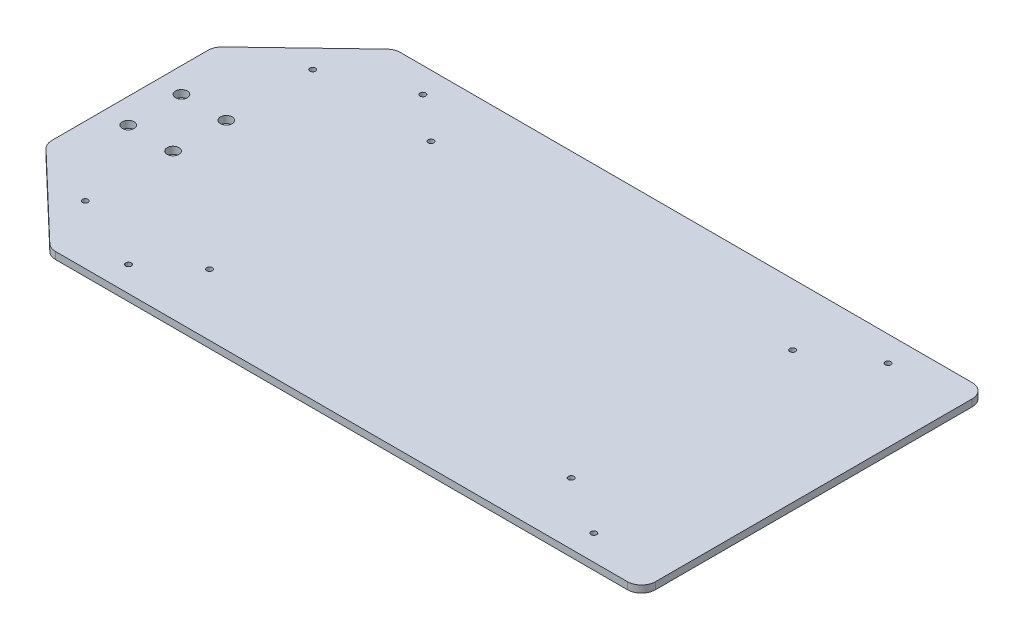
ISO-10303-21;
HEADER;
FILE_DESCRIPTION(('STEP AP214'),'2;1');
FILE_NAME('part.step','',(''),(''),'','','');
FILE_SCHEMA(('AUTOMOTIVE_DESIGN { 1 0 10303 214 1 1 1 1 }'));
ENDSEC;
DATA;
#1=APPLICATION_CONTEXT('core data for automotive mechanical design processes');
#2=APPLICATION_PROTOCOL_DEFINITION('international standard','automotive_design',2000,#1);
#3=PRODUCT_CONTEXT('',#1,'mechanical');
#4=PRODUCT('Part','Part','',(#3));
#5=PRODUCT_RELATED_PRODUCT_CATEGORY('part','',(#4));
#6=PRODUCT_DEFINITION_FORMATION('','',#4);
#7=PRODUCT_DEFINITION_CONTEXT('part definition',#1,'design');
#8=PRODUCT_DEFINITION('design','',#6,#7);
#9=PRODUCT_DEFINITION_SHAPE('','',#8);
#10=(LENGTH_UNIT() NAMED_UNIT(*) SI_UNIT(.MILLI.,.METRE.));
#11=(NAMED_UNIT(*) PLANE_ANGLE_UNIT() SI_UNIT($,.RADIAN.));
#12=(NAMED_UNIT(*) SI_UNIT($,.STERADIAN.) SOLID_ANGLE_UNIT());
#13=UNCERTAINTY_MEASURE_WITH_UNIT(LENGTH_MEASURE(1.E-05),#10,'distance_accuracy_value','');
#14=(GEOMETRIC_REPRESENTATION_CONTEXT(3) GLOBAL_UNCERTAINTY_ASSIGNED_CONTEXT((#13)) GLOBAL_UNIT_ASSIGNED_CONTEXT((#10,
#11,#12)) REPRESENTATION_CONTEXT('',''));
#15=CARTESIAN_POINT('',(0.,0.,0.));
#16=DIRECTION('',(0.,0.,1.));
#17=DIRECTION('',(1.,0.,0.));
#18=AXIS2_PLACEMENT_3D('',#15,#16,#17);
#19=CARTESIAN_POINT('',(-110.,2.5,0.));
#20=DIRECTION('',(1.,0.,0.));
#21=DIRECTION('',(0.,0.,-1.));
#22=AXIS2_PLACEMENT_3D('',#19,#20,#21);
#23=PLANE('',#22);
#24=DIRECTION('',(0.,0.,1.));
#25=VECTOR('',#24,1.);
#26=CARTESIAN_POINT('',(-110.,2.5,0.));
#27=LINE('',#26,#25);
#28=CARTESIAN_POINT('',(-110.,2.5,-27.8604971246611));
#29=VERTEX_POINT('',#28);
#30=CARTESIAN_POINT('',(-110.,2.5,27.8604971246611));
#31=VERTEX_POINT('',#30);
#32=EDGE_CURVE('E146',#29,#31,#27,.T.);
#33=ORIENTED_EDGE('',*,*,#32,.F.);
#34=DIRECTION('',(0.,-1.,0.));
#35=VECTOR('',#34,1.);
#36=CARTESIAN_POINT('',(-110.,0.,-27.8604971246611));
#37=LINE('',#36,#35);
#38=CARTESIAN_POINT('',(-110.,0.,-27.8604971246611));
#39=VERTEX_POINT('',#38);
#40=EDGE_CURVE('E182',#29,#39,#37,.T.);
#41=ORIENTED_EDGE('',*,*,#40,.T.);
#42=DIRECTION('',(0.,0.,1.));
#43=VECTOR('',#42,1.);
#44=CARTESIAN_POINT('',(-110.,0.,0.));
#45=LINE('',#44,#43);
#46=CARTESIAN_POINT('',(-110.,0.,27.8604971246611));
#47=VERTEX_POINT('',#46);
#48=EDGE_CURVE('E130',#39,#47,#45,.T.);
#49=ORIENTED_EDGE('',*,*,#48,.T.);
#50=DIRECTION('',(0.,-1.,0.));
#51=VECTOR('',#50,1.);
#52=CARTESIAN_POINT('',(-110.,2.5,27.8604971246611));
#53=LINE('',#52,#51);
#54=EDGE_CURVE('E180',#47,#31,#53,.F.);
#55=ORIENTED_EDGE('',*,*,#54,.T.);
#56=EDGE_LOOP('',(#33,#41,#49,#55));
#57=FACE_BOUND('',#56,.T.);
#58=ADVANCED_FACE('F34',(#57),#23,.F.);
#59=CARTESIAN_POINT('',(-67.4270270270271,2.5,70.6378378378378));
#60=DIRECTION('',(0.690475746682501,0.,-0.723355544143572));
#61=DIRECTION('',(-0.723355544143572,0.,-0.690475746682501));
#62=AXIS2_PLACEMENT_3D('',#59,#60,#61);
#63=PLANE('',#62);
#64=DIRECTION('',(0.723355544143572,0.,0.690475746682501));
#65=VECTOR('',#64,1.);
#66=CARTESIAN_POINT('',(-67.4270270270271,2.5,70.6378378378378));
#67=LINE('',#66,#65);
#68=CARTESIAN_POINT('',(-108.452378733413,2.5,31.477274845379));
#69=VERTEX_POINT('',#68);
#70=CARTESIAN_POINT('',(-78.449090006867,2.5,60.1167777207179));
#71=VERTEX_POINT('',#70);
#72=EDGE_CURVE('E290',#69,#71,#67,.T.);
#73=ORIENTED_EDGE('',*,*,#72,.F.);
#74=DIRECTION('',(0.,-1.,0.));
#75=VECTOR('',#74,1.);
#76=CARTESIAN_POINT('',(-108.452378733413,2.5,31.477274845379));
#77=LINE('',#76,#75);
#78=CARTESIAN_POINT('',(-108.452378733413,0.,31.477274845379));
#79=VERTEX_POINT('',#78);
#80=EDGE_CURVE('E186',#69,#79,#77,.T.);
#81=ORIENTED_EDGE('',*,*,#80,.T.);
#82=DIRECTION('',(0.723355544143572,0.,0.690475746682501));
#83=VECTOR('',#82,1.);
#84=CARTESIAN_POINT('',(-67.4270270270271,0.,70.6378378378378));
#85=LINE('',#84,#83);
#86=CARTESIAN_POINT('',(-78.449090006867,0.,60.1167777207179));
#87=VERTEX_POINT('',#86);
#88=EDGE_CURVE('E298',#79,#87,#85,.T.);
#89=ORIENTED_EDGE('',*,*,#88,.T.);
#90=DIRECTION('',(0.,-1.,0.));
#91=VECTOR('',#90,1.);
#92=CARTESIAN_POINT('',(-78.449090006867,2.5,60.1167777207179));
#93=LINE('',#92,#91);
#94=EDGE_CURVE('E184',#87,#71,#93,.F.);
#95=ORIENTED_EDGE('',*,*,#94,.T.);
#96=EDGE_LOOP('',(#73,#81,#89,#95));
#97=FACE_BOUND('',#96,.T.);
#98=ADVANCED_FACE('F322',(#97),#63,.F.);
#99=CARTESIAN_POINT('',(0.,2.5,61.5));
#100=DIRECTION('',(0.,0.,-1.));
#101=DIRECTION('',(-1.,0.,0.));
#102=AXIS2_PLACEMENT_3D('',#99,#100,#101);
#103=PLANE('',#102);
#104=DIRECTION('',(1.,0.,0.));
#105=VECTOR('',#104,1.);
#106=CARTESIAN_POINT('',(0.,2.5,61.5));
#107=LINE('',#106,#105);
#108=CARTESIAN_POINT('',(-74.9967112734545,2.5,61.5));
#109=VERTEX_POINT('',#108);
#110=CARTESIAN_POINT('',(129.,2.5,61.5));
#111=VERTEX_POINT('',#110);
#112=EDGE_CURVE('E293',#109,#111,#107,.T.);
#113=ORIENTED_EDGE('',*,*,#112,.F.);
#114=DIRECTION('',(0.,-1.,0.));
#115=VECTOR('',#114,1.);
#116=CARTESIAN_POINT('',(-74.9967112734545,2.5,61.5));
#117=LINE('',#116,#115);
#118=CARTESIAN_POINT('',(-74.9967112734545,0.,61.5));
#119=VERTEX_POINT('',#118);
#120=EDGE_CURVE('E191',#109,#119,#117,.T.);
#121=ORIENTED_EDGE('',*,*,#120,.T.);
#122=DIRECTION('',(1.,0.,0.));
#123=VECTOR('',#122,1.);
#124=CARTESIAN_POINT('',(0.,0.,61.5));
#125=LINE('',#124,#123);
#126=CARTESIAN_POINT('',(129.,0.,61.5));
#127=VERTEX_POINT('',#126);
#128=EDGE_CURVE('E301',#119,#127,#125,.T.);
#129=ORIENTED_EDGE('',*,*,#128,.T.);
#130=DIRECTION('',(0.,-1.,0.));
#131=VECTOR('',#130,1.);
#132=CARTESIAN_POINT('',(129.,2.5,61.5));
#133=LINE('',#132,#131);
#134=EDGE_CURVE('E189',#127,#111,#133,.F.);
#135=ORIENTED_EDGE('',*,*,#134,.T.);
#136=EDGE_LOOP('',(#113,#121,#129,#135));
#137=FACE_BOUND('',#136,.T.);
#138=ADVANCED_FACE('F330',(#137),#103,.F.);
#139=CARTESIAN_POINT('',(0.,2.5,-61.5));
#140=DIRECTION('',(0.,0.,-1.));
#141=DIRECTION('',(-1.,0.,0.));
#142=AXIS2_PLACEMENT_3D('',#139,#140,#141);
#143=PLANE('',#142);
#144=DIRECTION('',(1.,0.,0.));
#145=VECTOR('',#144,1.);
#146=CARTESIAN_POINT('',(0.,0.,-61.5));
#147=LINE('',#146,#145);
#148=CARTESIAN_POINT('',(-74.9967112734545,0.,-61.5));
#149=VERTEX_POINT('',#148);
#150=CARTESIAN_POINT('',(129.,0.,-61.5));
#151=VERTEX_POINT('',#150);
#152=EDGE_CURVE('E147',#149,#151,#147,.T.);
#153=ORIENTED_EDGE('',*,*,#152,.F.);
#154=DIRECTION('',(0.,-1.,0.));
#155=VECTOR('',#154,1.);
#156=CARTESIAN_POINT('',(-74.9967112734545,2.5,-61.5));
#157=LINE('',#156,#155);
#158=CARTESIAN_POINT('',(-74.9967112734545,2.5,-61.5));
#159=VERTEX_POINT('',#158);
#160=EDGE_CURVE('E169',#149,#159,#157,.F.);
#161=ORIENTED_EDGE('',*,*,#160,.T.);
#162=DIRECTION('',(1.,0.,0.));
#163=VECTOR('',#162,1.);
#164=CARTESIAN_POINT('',(0.,2.5,-61.5));
#165=LINE('',#164,#163);
#166=CARTESIAN_POINT('',(129.,2.5,-61.5));
#167=VERTEX_POINT('',#166);
#168=EDGE_CURVE('E156',#159,#167,#165,.T.);
#169=ORIENTED_EDGE('',*,*,#168,.T.);
#170=DIRECTION('',(0.,1.,0.));
#171=VECTOR('',#170,1.);
#172=CARTESIAN_POINT('',(129.,2.5,-61.5));
#173=LINE('',#172,#171);
#174=EDGE_CURVE('E167',#167,#151,#173,.F.);
#175=ORIENTED_EDGE('',*,*,#174,.T.);
#176=EDGE_LOOP('',(#153,#161,#169,#175));
#177=FACE_BOUND('',#176,.T.);
#178=ADVANCED_FACE('F309',(#177),#143,.T.);
#179=CARTESIAN_POINT('',(-67.427027027027,2.5,-70.6378378378378));
#180=DIRECTION('',(-0.6904757466825,0.,-0.723355544143572));
#181=DIRECTION('',(-0.723355544143572,0.,0.690475746682501));
#182=AXIS2_PLACEMENT_3D('',#179,#180,#181);
#183=PLANE('',#182);
#184=DIRECTION('',(0.723355544143572,0.,-0.690475746682501));
#185=VECTOR('',#184,1.);
#186=CARTESIAN_POINT('',(-67.427027027027,2.5,-70.6378378378378));
#187=LINE('',#186,#185);
#188=CARTESIAN_POINT('',(-108.452378733413,2.5,-31.477274845379));
#189=VERTEX_POINT('',#188);
#190=CARTESIAN_POINT('',(-78.449090006867,2.5,-60.1167777207178));
#191=VERTEX_POINT('',#190);
#192=EDGE_CURVE('E152',#189,#191,#187,.T.);
#193=ORIENTED_EDGE('',*,*,#192,.T.);
#194=DIRECTION('',(0.,-1.,0.));
#195=VECTOR('',#194,1.);
#196=CARTESIAN_POINT('',(-78.449090006867,2.5,-60.1167777207178));
#197=LINE('',#196,#195);
#198=CARTESIAN_POINT('',(-78.449090006867,0.,-60.1167777207178));
#199=VERTEX_POINT('',#198);
#200=EDGE_CURVE('E145',#191,#199,#197,.T.);
#201=ORIENTED_EDGE('',*,*,#200,.T.);
#202=DIRECTION('',(0.723355544143572,0.,-0.690475746682501));
#203=VECTOR('',#202,1.);
#204=CARTESIAN_POINT('',(-67.427027027027,0.,-70.6378378378378));
#205=LINE('',#204,#203);
#206=CARTESIAN_POINT('',(-108.452378733413,0.,-31.477274845379));
#207=VERTEX_POINT('',#206);
#208=EDGE_CURVE('E128',#207,#199,#205,.T.);
#209=ORIENTED_EDGE('',*,*,#208,.F.);
#210=DIRECTION('',(0.,-1.,0.));
#211=VECTOR('',#210,1.);
#212=CARTESIAN_POINT('',(-108.452378733413,2.5,-31.477274845379));
#213=LINE('',#212,#211);
#214=EDGE_CURVE('E142',#207,#189,#213,.F.);
#215=ORIENTED_EDGE('',*,*,#214,.T.);
#216=EDGE_LOOP('',(#193,#201,#209,#215));
#217=FACE_BOUND('',#216,.T.);
#218=ADVANCED_FACE('F141',(#217),#183,.T.);
#219=CARTESIAN_POINT('',(0.,2.5,0.));
#220=DIRECTION('',(0.,1.,0.));
#221=DIRECTION('',(0.,0.,1.));
#222=AXIS2_PLACEMENT_3D('',#219,#220,#221);
#223=PLANE('',#222);
#224=CARTESIAN_POINT('',(-85.3544194842508,2.5,-40.5633927308067));
#225=DIRECTION('',(0.,1.,0.));
#226=DIRECTION('',(0.,0.,1.));
#227=AXIS2_PLACEMENT_3D('',#224,#225,#226);
#228=CIRCLE('',#227,0.999999999999998);
#229=CARTESIAN_POINT('',(-85.3544194842508,2.5,-39.5633927308067));
#230=VERTEX_POINT('',#229);
#231=EDGE_CURVE('E211',#230,#230,#228,.T.);
#232=ORIENTED_EDGE('',*,*,#231,.F.);
#233=EDGE_LOOP('',(#232));
#234=FACE_BOUND('',#233,.T.);
#235=CARTESIAN_POINT('',(-85.3544194842508,2.5,40.5633927308066));
#236=DIRECTION('',(0.,1.,0.));
#237=DIRECTION('',(0.,0.,1.));
#238=AXIS2_PLACEMENT_3D('',#235,#236,#237);
#239=CIRCLE('',#238,0.999999999999998);
#240=CARTESIAN_POINT('',(-85.3544194842508,2.5,41.5633927308066));
#241=VERTEX_POINT('',#240);
#242=EDGE_CURVE('E663',#241,#241,#239,.T.);
#243=ORIENTED_EDGE('',*,*,#242,.F.);
#244=EDGE_LOOP('',(#243));
#245=FACE_BOUND('',#244,.T.);
#246=CARTESIAN_POINT('',(-42.0922804300341,2.5,-39.5));
#247=DIRECTION('',(0.,-1.,0.));
#248=DIRECTION('',(0.,0.,-1.));
#249=AXIS2_PLACEMENT_3D('',#246,#247,#248);
#250=CIRCLE('',#249,0.999999999999998);
#251=CARTESIAN_POINT('',(-42.0922804300341,2.5,-40.5));
#252=VERTEX_POINT('',#251);
#253=EDGE_CURVE('E227',#252,#252,#250,.T.);
#254=ORIENTED_EDGE('',*,*,#253,.T.);
#255=EDGE_LOOP('',(#254));
#256=FACE_BOUND('',#255,.T.);
#257=CARTESIAN_POINT('',(86.9077195699659,2.5,39.5));
#258=DIRECTION('',(0.,-1.,0.));
#259=DIRECTION('',(0.,0.,-1.));
#260=AXIS2_PLACEMENT_3D('',#257,#258,#259);
#261=CIRCLE('',#260,0.999999999999998);
#262=CARTESIAN_POINT('',(86.9077195699659,2.5,38.5));
#263=VERTEX_POINT('',#262);
#264=EDGE_CURVE('E220',#263,#263,#261,.T.);
#265=ORIENTED_EDGE('',*,*,#264,.T.);
#266=EDGE_LOOP('',(#265));
#267=FACE_BOUND('',#266,.T.);
#268=CARTESIAN_POINT('',(86.9077195699659,2.5,-39.5));
#269=DIRECTION('',(0.,-1.,0.));
#270=DIRECTION('',(0.,0.,-1.));
#271=AXIS2_PLACEMENT_3D('',#268,#269,#270);
#272=CIRCLE('',#271,0.999999999999998);
#273=CARTESIAN_POINT('',(86.9077195699659,2.5,-40.5));
#274=VERTEX_POINT('',#273);
#275=EDGE_CURVE('E208',#274,#274,#272,.T.);
#276=ORIENTED_EDGE('',*,*,#275,.T.);
#277=EDGE_LOOP('',(#276));
#278=FACE_BOUND('',#277,.T.);
#279=CARTESIAN_POINT('',(-42.0922804300341,2.5,39.5));
#280=DIRECTION('',(0.,-1.,0.));
#281=DIRECTION('',(0.,0.,-1.));
#282=AXIS2_PLACEMENT_3D('',#279,#280,#281);
#283=CIRCLE('',#282,0.999999999999998);
#284=CARTESIAN_POINT('',(-42.0922804300341,2.5,38.5));
#285=VERTEX_POINT('',#284);
#286=EDGE_CURVE('E235',#285,#285,#283,.T.);
#287=ORIENTED_EDGE('',*,*,#286,.T.);
#288=EDGE_LOOP('',(#287));
#289=FACE_BOUND('',#288,.T.);
#290=CARTESIAN_POINT('',(108.,2.5,52.5));
#291=DIRECTION('',(0.,1.,0.));
#292=DIRECTION('',(0.,0.,1.));
#293=AXIS2_PLACEMENT_3D('',#290,#291,#292);
#294=CIRCLE('',#293,0.999999999999998);
#295=CARTESIAN_POINT('',(108.,2.5,53.5));
#296=VERTEX_POINT('',#295);
#297=EDGE_CURVE('E247',#296,#296,#294,.T.);
#298=ORIENTED_EDGE('',*,*,#297,.F.);
#299=EDGE_LOOP('',(#298));
#300=FACE_BOUND('',#299,.T.);
#301=CARTESIAN_POINT('',(-58.,2.5,-52.5));
#302=DIRECTION('',(0.,1.,0.));
#303=DIRECTION('',(0.,0.,1.));
#304=AXIS2_PLACEMENT_3D('',#301,#302,#303);
#305=CIRCLE('',#304,0.999999999999998);
#306=CARTESIAN_POINT('',(-58.,2.5,-51.5));
#307=VERTEX_POINT('',#306);
#308=EDGE_CURVE('E254',#307,#307,#305,.T.);
#309=ORIENTED_EDGE('',*,*,#308,.F.);
#310=EDGE_LOOP('',(#309));
#311=FACE_BOUND('',#310,.T.);
#312=CARTESIAN_POINT('',(108.,2.5,-52.5));
#313=DIRECTION('',(0.,1.,0.));
#314=DIRECTION('',(0.,0.,1.));
#315=AXIS2_PLACEMENT_3D('',#312,#313,#314);
#316=CIRCLE('',#315,0.999999999999998);
#317=CARTESIAN_POINT('',(108.,2.5,-51.5));
#318=VERTEX_POINT('',#317);
#319=EDGE_CURVE('E241',#318,#318,#316,.T.);
#320=ORIENTED_EDGE('',*,*,#319,.F.);
#321=EDGE_LOOP('',(#320));
#322=FACE_BOUND('',#321,.T.);
#323=CARTESIAN_POINT('',(-58.,2.5,52.5));
#324=DIRECTION('',(0.,1.,0.));
#325=DIRECTION('',(0.,0.,1.));
#326=AXIS2_PLACEMENT_3D('',#323,#324,#325);
#327=CIRCLE('',#326,0.999999999999998);
#328=CARTESIAN_POINT('',(-58.,2.5,53.5));
#329=VERTEX_POINT('',#328);
#330=EDGE_CURVE('E250',#329,#329,#327,.T.);
#331=ORIENTED_EDGE('',*,*,#330,.F.);
#332=EDGE_LOOP('',(#331));
#333=FACE_BOUND('',#332,.T.);
#334=CARTESIAN_POINT('',(-85.1032056154411,2.5,-9.5));
#335=DIRECTION('',(0.,1.,0.));
#336=DIRECTION('',(0.,0.,1.));
#337=AXIS2_PLACEMENT_3D('',#334,#335,#336);
#338=CIRCLE('',#337,2.1);
#339=CARTESIAN_POINT('',(-85.1032056154411,2.5,-7.4));
#340=VERTEX_POINT('',#339);
#341=EDGE_CURVE('E275',#340,#340,#338,.T.);
#342=ORIENTED_EDGE('',*,*,#341,.F.);
#343=EDGE_LOOP('',(#342));
#344=FACE_BOUND('',#343,.T.);
#345=CARTESIAN_POINT('',(-101.103205615441,2.5,9.5));
#346=DIRECTION('',(0.,1.,0.));
#347=DIRECTION('',(0.,0.,1.));
#348=AXIS2_PLACEMENT_3D('',#345,#346,#347);
#349=CIRCLE('',#348,2.1);
#350=CARTESIAN_POINT('',(-101.103205615441,2.5,11.6));
#351=VERTEX_POINT('',#350);
#352=EDGE_CURVE('E268',#351,#351,#349,.T.);
#353=ORIENTED_EDGE('',*,*,#352,.F.);
#354=EDGE_LOOP('',(#353));
#355=FACE_BOUND('',#354,.T.);
#356=CARTESIAN_POINT('',(-85.1032056154411,2.5,9.5));
#357=DIRECTION('',(0.,1.,0.));
#358=DIRECTION('',(0.,0.,1.));
#359=AXIS2_PLACEMENT_3D('',#356,#357,#358);
#360=CIRCLE('',#359,2.1);
#361=CARTESIAN_POINT('',(-85.1032056154411,2.5,11.6));
#362=VERTEX_POINT('',#361);
#363=EDGE_CURVE('E262',#362,#362,#360,.T.);
#364=ORIENTED_EDGE('',*,*,#363,.F.);
#365=EDGE_LOOP('',(#364));
#366=FACE_BOUND('',#365,.T.);
#367=CARTESIAN_POINT('',(-101.103205615441,2.5,-9.5));
#368=DIRECTION('',(0.,1.,0.));
#369=DIRECTION('',(0.,0.,1.));
#370=AXIS2_PLACEMENT_3D('',#367,#368,#369);
#371=CIRCLE('',#370,2.1);
#372=CARTESIAN_POINT('',(-101.103205615441,2.5,-7.4));
#373=VERTEX_POINT('',#372);
#374=EDGE_CURVE('E274',#373,#373,#371,.T.);
#375=ORIENTED_EDGE('',*,*,#374,.F.);
#376=EDGE_LOOP('',(#375));
#377=FACE_BOUND('',#376,.T.);
#378=ORIENTED_EDGE('',*,*,#168,.F.);
#379=CARTESIAN_POINT('',(-74.9967112734545,2.5,-56.5));
#380=DIRECTION('',(0.,1.,0.));
#381=DIRECTION('',(0.,0.,1.));
#382=AXIS2_PLACEMENT_3D('',#379,#380,#381);
#383=CIRCLE('',#382,5.);
#384=EDGE_CURVE('E178',#159,#191,#383,.T.);
#385=ORIENTED_EDGE('',*,*,#384,.T.);
#386=ORIENTED_EDGE('',*,*,#192,.F.);
#387=CARTESIAN_POINT('',(-105.,2.5,-27.8604971246611));
#388=DIRECTION('',(0.,1.,0.));
#389=DIRECTION('',(0.,0.,1.));
#390=AXIS2_PLACEMENT_3D('',#387,#388,#389);
#391=CIRCLE('',#390,5.);
#392=EDGE_CURVE('E151',#189,#29,#391,.T.);
#393=ORIENTED_EDGE('',*,*,#392,.T.);
#394=ORIENTED_EDGE('',*,*,#32,.T.);
#395=CARTESIAN_POINT('',(-105.,2.5,27.8604971246611));
#396=DIRECTION('',(0.,1.,0.));
#397=DIRECTION('',(0.,0.,1.));
#398=AXIS2_PLACEMENT_3D('',#395,#396,#397);
#399=CIRCLE('',#398,5.);
#400=EDGE_CURVE('E175',#31,#69,#399,.T.);
#401=ORIENTED_EDGE('',*,*,#400,.T.);
#402=ORIENTED_EDGE('',*,*,#72,.T.);
#403=CARTESIAN_POINT('',(-74.9967112734545,2.5,56.5));
#404=DIRECTION('',(0.,1.,0.));
#405=DIRECTION('',(0.,0.,1.));
#406=AXIS2_PLACEMENT_3D('',#403,#404,#405);
#407=CIRCLE('',#406,5.);
#408=EDGE_CURVE('E173',#71,#109,#407,.T.);
#409=ORIENTED_EDGE('',*,*,#408,.T.);
#410=ORIENTED_EDGE('',*,*,#112,.T.);
#411=CARTESIAN_POINT('',(129.,2.5,56.5));
#412=DIRECTION('',(0.,1.,0.));
#413=DIRECTION('',(0.,0.,1.));
#414=AXIS2_PLACEMENT_3D('',#411,#412,#413);
#415=CIRCLE('',#414,5.);
#416=CARTESIAN_POINT('',(134.,2.5,56.5));
#417=VERTEX_POINT('',#416);
#418=EDGE_CURVE('E49',#111,#417,#415,.T.);
#419=ORIENTED_EDGE('',*,*,#418,.T.);
#420=DIRECTION('',(0.,0.,1.));
#421=VECTOR('',#420,1.);
#422=CARTESIAN_POINT('',(134.,2.5,-61.5));
#423=LINE('',#422,#421);
#424=CARTESIAN_POINT('',(134.,2.5,-56.5));
#425=VERTEX_POINT('',#424);
#426=EDGE_CURVE('E200',#425,#417,#423,.T.);
#427=ORIENTED_EDGE('',*,*,#426,.F.);
#428=CARTESIAN_POINT('',(129.,2.5,-56.5));
#429=DIRECTION('',(0.,1.,0.));
#430=DIRECTION('',(0.,0.,1.));
#431=AXIS2_PLACEMENT_3D('',#428,#429,#430);
#432=CIRCLE('',#431,5.);
#433=EDGE_CURVE('E57',#425,#167,#432,.T.);
#434=ORIENTED_EDGE('',*,*,#433,.T.);
#435=EDGE_LOOP('',(#378,#385,#386,#393,#394,#401,#402,#409,#410,#419,#427,#434));
#436=FACE_BOUND('',#435,.T.);
#437=ADVANCED_FACE('F307',(#234,#245,#256,#267,#278,#289,#300,#311,#322,#333,#344,#355,#366,
#377,#436),#223,.T.);
#438=CARTESIAN_POINT('',(0.,0.,0.));
#439=DIRECTION('',(0.,1.,0.));
#440=DIRECTION('',(0.,0.,1.));
#441=AXIS2_PLACEMENT_3D('',#438,#439,#440);
#442=PLANE('',#441);
#443=CARTESIAN_POINT('',(-85.3544194842508,0.,-40.5633927308067));
#444=DIRECTION('',(0.,1.,0.));
#445=DIRECTION('',(0.,0.,1.));
#446=AXIS2_PLACEMENT_3D('',#443,#444,#445);
#447=CIRCLE('',#446,0.999999999999998);
#448=CARTESIAN_POINT('',(-85.3544194842508,0.,-39.5633927308067));
#449=VERTEX_POINT('',#448);
#450=EDGE_CURVE('E206',#449,#449,#447,.T.);
#451=ORIENTED_EDGE('',*,*,#450,.T.);
#452=EDGE_LOOP('',(#451));
#453=FACE_BOUND('',#452,.T.);
#454=CARTESIAN_POINT('',(-85.3544194842508,0.,40.5633927308066));
#455=DIRECTION('',(0.,1.,0.));
#456=DIRECTION('',(0.,0.,1.));
#457=AXIS2_PLACEMENT_3D('',#454,#455,#456);
#458=CIRCLE('',#457,0.999999999999998);
#459=CARTESIAN_POINT('',(-85.3544194842508,0.,41.5633927308066));
#460=VERTEX_POINT('',#459);
#461=EDGE_CURVE('E214',#460,#460,#458,.T.);
#462=ORIENTED_EDGE('',*,*,#461,.T.);
#463=EDGE_LOOP('',(#462));
#464=FACE_BOUND('',#463,.T.);
#465=CARTESIAN_POINT('',(-42.0922804300341,0.,-39.5));
#466=DIRECTION('',(0.,-1.,0.));
#467=DIRECTION('',(0.,0.,-1.));
#468=AXIS2_PLACEMENT_3D('',#465,#466,#467);
#469=CIRCLE('',#468,0.999999999999998);
#470=CARTESIAN_POINT('',(-42.0922804300341,0.,-40.5));
#471=VERTEX_POINT('',#470);
#472=EDGE_CURVE('E223',#471,#471,#469,.T.);
#473=ORIENTED_EDGE('',*,*,#472,.F.);
#474=EDGE_LOOP('',(#473));
#475=FACE_BOUND('',#474,.T.);
#476=CARTESIAN_POINT('',(86.9077195699659,0.,39.5));
#477=DIRECTION('',(0.,-1.,0.));
#478=DIRECTION('',(0.,0.,-1.));
#479=AXIS2_PLACEMENT_3D('',#476,#477,#478);
#480=CIRCLE('',#479,0.999999999999998);
#481=CARTESIAN_POINT('',(86.9077195699659,0.,38.5));
#482=VERTEX_POINT('',#481);
#483=EDGE_CURVE('E230',#482,#482,#480,.T.);
#484=ORIENTED_EDGE('',*,*,#483,.F.);
#485=EDGE_LOOP('',(#484));
#486=FACE_BOUND('',#485,.T.);
#487=CARTESIAN_POINT('',(86.9077195699659,0.,-39.5));
#488=DIRECTION('',(0.,-1.,0.));
#489=DIRECTION('',(0.,0.,-1.));
#490=AXIS2_PLACEMENT_3D('',#487,#488,#489);
#491=CIRCLE('',#490,0.999999999999998);
#492=CARTESIAN_POINT('',(86.9077195699659,0.,-40.5));
#493=VERTEX_POINT('',#492);
#494=EDGE_CURVE('E217',#493,#493,#491,.T.);
#495=ORIENTED_EDGE('',*,*,#494,.F.);
#496=EDGE_LOOP('',(#495));
#497=FACE_BOUND('',#496,.T.);
#498=CARTESIAN_POINT('',(-42.0922804300341,0.,39.5));
#499=DIRECTION('',(0.,-1.,0.));
#500=DIRECTION('',(0.,0.,-1.));
#501=AXIS2_PLACEMENT_3D('',#498,#499,#500);
#502=CIRCLE('',#501,0.999999999999998);
#503=CARTESIAN_POINT('',(-42.0922804300341,0.,38.5));
#504=VERTEX_POINT('',#503);
#505=EDGE_CURVE('E226',#504,#504,#502,.T.);
#506=ORIENTED_EDGE('',*,*,#505,.F.);
#507=EDGE_LOOP('',(#506));
#508=FACE_BOUND('',#507,.T.);
#509=CARTESIAN_POINT('',(108.,0.,52.5));
#510=DIRECTION('',(0.,1.,0.));
#511=DIRECTION('',(0.,0.,1.));
#512=AXIS2_PLACEMENT_3D('',#509,#510,#511);
#513=CIRCLE('',#512,0.999999999999998);
#514=CARTESIAN_POINT('',(108.,0.,53.5));
#515=VERTEX_POINT('',#514);
#516=EDGE_CURVE('E251',#515,#515,#513,.T.);
#517=ORIENTED_EDGE('',*,*,#516,.T.);
#518=EDGE_LOOP('',(#517));
#519=FACE_BOUND('',#518,.T.);
#520=CARTESIAN_POINT('',(-58.,0.,-52.5));
#521=DIRECTION('',(0.,1.,0.));
#522=DIRECTION('',(0.,0.,1.));
#523=AXIS2_PLACEMENT_3D('',#520,#521,#522);
#524=CIRCLE('',#523,0.999999999999998);
#525=CARTESIAN_POINT('',(-58.,0.,-51.5));
#526=VERTEX_POINT('',#525);
#527=EDGE_CURVE('E244',#526,#526,#524,.T.);
#528=ORIENTED_EDGE('',*,*,#527,.T.);
#529=EDGE_LOOP('',(#528));
#530=FACE_BOUND('',#529,.T.);
#531=CARTESIAN_POINT('',(108.,0.,-52.5));
#532=DIRECTION('',(0.,1.,0.));
#533=DIRECTION('',(0.,0.,1.));
#534=AXIS2_PLACEMENT_3D('',#531,#532,#533);
#535=CIRCLE('',#534,0.999999999999998);
#536=CARTESIAN_POINT('',(108.,0.,-51.5));
#537=VERTEX_POINT('',#536);
#538=EDGE_CURVE('E238',#537,#537,#535,.T.);
#539=ORIENTED_EDGE('',*,*,#538,.T.);
#540=EDGE_LOOP('',(#539));
#541=FACE_BOUND('',#540,.T.);
#542=CARTESIAN_POINT('',(-58.,0.,52.5));
#543=DIRECTION('',(0.,1.,0.));
#544=DIRECTION('',(0.,0.,1.));
#545=AXIS2_PLACEMENT_3D('',#542,#543,#544);
#546=CIRCLE('',#545,0.999999999999998);
#547=CARTESIAN_POINT('',(-58.,0.,53.5));
#548=VERTEX_POINT('',#547);
#549=EDGE_CURVE('E259',#548,#548,#546,.T.);
#550=ORIENTED_EDGE('',*,*,#549,.T.);
#551=EDGE_LOOP('',(#550));
#552=FACE_BOUND('',#551,.T.);
#553=CARTESIAN_POINT('',(-85.1032056154411,0.,-9.5));
#554=DIRECTION('',(0.,1.,0.));
#555=DIRECTION('',(0.,0.,1.));
#556=AXIS2_PLACEMENT_3D('',#553,#554,#555);
#557=CIRCLE('',#556,2.1);
#558=CARTESIAN_POINT('',(-85.1032056154411,0.,-7.4));
#559=VERTEX_POINT('',#558);
#560=EDGE_CURVE('E271',#559,#559,#557,.T.);
#561=ORIENTED_EDGE('',*,*,#560,.T.);
#562=EDGE_LOOP('',(#561));
#563=FACE_BOUND('',#562,.T.);
#564=CARTESIAN_POINT('',(-101.103205615441,0.,9.5));
#565=DIRECTION('',(0.,1.,0.));
#566=DIRECTION('',(0.,0.,1.));
#567=AXIS2_PLACEMENT_3D('',#564,#565,#566);
#568=CIRCLE('',#567,2.1);
#569=CARTESIAN_POINT('',(-101.103205615441,0.,11.6));
#570=VERTEX_POINT('',#569);
#571=EDGE_CURVE('E278',#570,#570,#568,.T.);
#572=ORIENTED_EDGE('',*,*,#571,.T.);
#573=EDGE_LOOP('',(#572));
#574=FACE_BOUND('',#573,.T.);
#575=CARTESIAN_POINT('',(-85.1032056154411,0.,9.5));
#576=DIRECTION('',(0.,1.,0.));
#577=DIRECTION('',(0.,0.,1.));
#578=AXIS2_PLACEMENT_3D('',#575,#576,#577);
#579=CIRCLE('',#578,2.1);
#580=CARTESIAN_POINT('',(-85.1032056154411,0.,11.6));
#581=VERTEX_POINT('',#580);
#582=EDGE_CURVE('E265',#581,#581,#579,.T.);
#583=ORIENTED_EDGE('',*,*,#582,.T.);
#584=EDGE_LOOP('',(#583));
#585=FACE_BOUND('',#584,.T.);
#586=CARTESIAN_POINT('',(-101.103205615441,0.,-9.5));
#587=DIRECTION('',(0.,1.,0.));
#588=DIRECTION('',(0.,0.,1.));
#589=AXIS2_PLACEMENT_3D('',#586,#587,#588);
#590=CIRCLE('',#589,2.1);
#591=CARTESIAN_POINT('',(-101.103205615441,0.,-7.4));
#592=VERTEX_POINT('',#591);
#593=EDGE_CURVE('E283',#592,#592,#590,.T.);
#594=ORIENTED_EDGE('',*,*,#593,.T.);
#595=EDGE_LOOP('',(#594));
#596=FACE_BOUND('',#595,.T.);
#597=ORIENTED_EDGE('',*,*,#208,.T.);
#598=CARTESIAN_POINT('',(-74.9967112734545,0.,-56.5));
#599=DIRECTION('',(0.,1.,0.));
#600=DIRECTION('',(0.,0.,1.));
#601=AXIS2_PLACEMENT_3D('',#598,#599,#600);
#602=CIRCLE('',#601,5.);
#603=EDGE_CURVE('E135',#199,#149,#602,.F.);
#604=ORIENTED_EDGE('',*,*,#603,.T.);
#605=ORIENTED_EDGE('',*,*,#152,.T.);
#606=CARTESIAN_POINT('',(129.,0.,-56.5));
#607=DIRECTION('',(0.,1.,0.));
#608=DIRECTION('',(0.,0.,1.));
#609=AXIS2_PLACEMENT_3D('',#606,#607,#608);
#610=CIRCLE('',#609,5.);
#611=CARTESIAN_POINT('',(134.,0.,-56.5));
#612=VERTEX_POINT('',#611);
#613=EDGE_CURVE('E161',#151,#612,#610,.F.);
#614=ORIENTED_EDGE('',*,*,#613,.T.);
#615=DIRECTION('',(0.,0.,-1.));
#616=VECTOR('',#615,1.);
#617=CARTESIAN_POINT('',(134.,0.,61.5));
#618=LINE('',#617,#616);
#619=CARTESIAN_POINT('',(134.,0.,56.5));
#620=VERTEX_POINT('',#619);
#621=EDGE_CURVE('E199',#620,#612,#618,.T.);
#622=ORIENTED_EDGE('',*,*,#621,.F.);
#623=CARTESIAN_POINT('',(129.,0.,56.5));
#624=DIRECTION('',(0.,1.,0.));
#625=DIRECTION('',(0.,0.,1.));
#626=AXIS2_PLACEMENT_3D('',#623,#624,#625);
#627=CIRCLE('',#626,5.);
#628=EDGE_CURVE('E154',#620,#127,#627,.F.);
#629=ORIENTED_EDGE('',*,*,#628,.T.);
#630=ORIENTED_EDGE('',*,*,#128,.F.);
#631=CARTESIAN_POINT('',(-74.9967112734545,0.,56.5));
#632=DIRECTION('',(0.,1.,0.));
#633=DIRECTION('',(0.,0.,1.));
#634=AXIS2_PLACEMENT_3D('',#631,#632,#633);
#635=CIRCLE('',#634,5.);
#636=EDGE_CURVE('E163',#119,#87,#635,.F.);
#637=ORIENTED_EDGE('',*,*,#636,.T.);
#638=ORIENTED_EDGE('',*,*,#88,.F.);
#639=CARTESIAN_POINT('',(-105.,0.,27.8604971246611));
#640=DIRECTION('',(0.,1.,0.));
#641=DIRECTION('',(0.,0.,1.));
#642=AXIS2_PLACEMENT_3D('',#639,#640,#641);
#643=CIRCLE('',#642,5.);
#644=EDGE_CURVE('E136',#79,#47,#643,.F.);
#645=ORIENTED_EDGE('',*,*,#644,.T.);
#646=ORIENTED_EDGE('',*,*,#48,.F.);
#647=CARTESIAN_POINT('',(-105.,0.,-27.8604971246611));
#648=DIRECTION('',(0.,1.,0.));
#649=DIRECTION('',(0.,0.,1.));
#650=AXIS2_PLACEMENT_3D('',#647,#648,#649);
#651=CIRCLE('',#650,5.);
#652=EDGE_CURVE('E125',#39,#207,#651,.F.);
#653=ORIENTED_EDGE('',*,*,#652,.T.);
#654=EDGE_LOOP('',(#597,#604,#605,#614,#622,#629,#630,#637,#638,#645,#646,#653));
#655=FACE_BOUND('',#654,.T.);
#656=ADVANCED_FACE('F127',(#453,#464,#475,#486,#497,#508,#519,#530,#541,#552,#563,#574,#585,
#596,#655),#442,.F.);
#657=CARTESIAN_POINT('',(-101.103205615441,0.,-9.5));
#658=DIRECTION('',(0.,1.,0.));
#659=DIRECTION('',(0.,0.,1.));
#660=AXIS2_PLACEMENT_3D('',#657,#658,#659);
#661=CYLINDRICAL_SURFACE('',#660,2.1);
#662=ORIENTED_EDGE('',*,*,#593,.F.);
#663=EDGE_LOOP('',(#662));
#664=FACE_BOUND('',#663,.T.);
#665=ORIENTED_EDGE('',*,*,#374,.T.);
#666=EDGE_LOOP('',(#665));
#667=FACE_BOUND('',#666,.T.);
#668=ADVANCED_FACE('F386',(#664,#667),#661,.F.);
#669=CARTESIAN_POINT('',(-85.1032056154411,0.,9.5));
#670=DIRECTION('',(0.,1.,0.));
#671=DIRECTION('',(0.,0.,1.));
#672=AXIS2_PLACEMENT_3D('',#669,#670,#671);
#673=CYLINDRICAL_SURFACE('',#672,2.1);
#674=ORIENTED_EDGE('',*,*,#582,.F.);
#675=EDGE_LOOP('',(#674));
#676=FACE_BOUND('',#675,.T.);
#677=ORIENTED_EDGE('',*,*,#363,.T.);
#678=EDGE_LOOP('',(#677));
#679=FACE_BOUND('',#678,.T.);
#680=ADVANCED_FACE('F443',(#676,#679),#673,.F.);
#681=CARTESIAN_POINT('',(-101.103205615441,0.,9.5));
#682=DIRECTION('',(0.,1.,0.));
#683=DIRECTION('',(0.,0.,1.));
#684=AXIS2_PLACEMENT_3D('',#681,#682,#683);
#685=CYLINDRICAL_SURFACE('',#684,2.1);
#686=ORIENTED_EDGE('',*,*,#571,.F.);
#687=EDGE_LOOP('',(#686));
#688=FACE_BOUND('',#687,.T.);
#689=ORIENTED_EDGE('',*,*,#352,.T.);
#690=EDGE_LOOP('',(#689));
#691=FACE_BOUND('',#690,.T.);
#692=ADVANCED_FACE('F446',(#688,#691),#685,.F.);
#693=CARTESIAN_POINT('',(-85.1032056154411,0.,-9.5));
#694=DIRECTION('',(0.,1.,0.));
#695=DIRECTION('',(0.,0.,1.));
#696=AXIS2_PLACEMENT_3D('',#693,#694,#695);
#697=CYLINDRICAL_SURFACE('',#696,2.1);
#698=ORIENTED_EDGE('',*,*,#560,.F.);
#699=EDGE_LOOP('',(#698));
#700=FACE_BOUND('',#699,.T.);
#701=ORIENTED_EDGE('',*,*,#341,.T.);
#702=EDGE_LOOP('',(#701));
#703=FACE_BOUND('',#702,.T.);
#704=ADVANCED_FACE('F441',(#700,#703),#697,.F.);
#705=CARTESIAN_POINT('',(-58.,0.,52.5));
#706=DIRECTION('',(0.,1.,0.));
#707=DIRECTION('',(0.,0.,1.));
#708=AXIS2_PLACEMENT_3D('',#705,#706,#707);
#709=CYLINDRICAL_SURFACE('',#708,0.999999999999998);
#710=ORIENTED_EDGE('',*,*,#549,.F.);
#711=EDGE_LOOP('',(#710));
#712=FACE_BOUND('',#711,.T.);
#713=ORIENTED_EDGE('',*,*,#330,.T.);
#714=EDGE_LOOP('',(#713));
#715=FACE_BOUND('',#714,.T.);
#716=ADVANCED_FACE('F431',(#712,#715),#709,.F.);
#717=CARTESIAN_POINT('',(108.,0.,-52.5));
#718=DIRECTION('',(0.,1.,0.));
#719=DIRECTION('',(0.,0.,1.));
#720=AXIS2_PLACEMENT_3D('',#717,#718,#719);
#721=CYLINDRICAL_SURFACE('',#720,0.999999999999998);
#722=ORIENTED_EDGE('',*,*,#538,.F.);
#723=EDGE_LOOP('',(#722));
#724=FACE_BOUND('',#723,.T.);
#725=ORIENTED_EDGE('',*,*,#319,.T.);
#726=EDGE_LOOP('',(#725));
#727=FACE_BOUND('',#726,.T.);
#728=ADVANCED_FACE('F427',(#724,#727),#721,.F.);
#729=CARTESIAN_POINT('',(-58.,0.,-52.5));
#730=DIRECTION('',(0.,1.,0.));
#731=DIRECTION('',(0.,0.,1.));
#732=AXIS2_PLACEMENT_3D('',#729,#730,#731);
#733=CYLINDRICAL_SURFACE('',#732,0.999999999999998);
#734=ORIENTED_EDGE('',*,*,#527,.F.);
#735=EDGE_LOOP('',(#734));
#736=FACE_BOUND('',#735,.T.);
#737=ORIENTED_EDGE('',*,*,#308,.T.);
#738=EDGE_LOOP('',(#737));
#739=FACE_BOUND('',#738,.T.);
#740=ADVANCED_FACE('F430',(#736,#739),#733,.F.);
#741=CARTESIAN_POINT('',(108.,0.,52.5));
#742=DIRECTION('',(0.,1.,0.));
#743=DIRECTION('',(0.,0.,1.));
#744=AXIS2_PLACEMENT_3D('',#741,#742,#743);
#745=CYLINDRICAL_SURFACE('',#744,0.999999999999998);
#746=ORIENTED_EDGE('',*,*,#516,.F.);
#747=EDGE_LOOP('',(#746));
#748=FACE_BOUND('',#747,.T.);
#749=ORIENTED_EDGE('',*,*,#297,.T.);
#750=EDGE_LOOP('',(#749));
#751=FACE_BOUND('',#750,.T.);
#752=ADVANCED_FACE('F425',(#748,#751),#745,.F.);
#753=CARTESIAN_POINT('',(-42.0922804300341,2.5,39.5));
#754=DIRECTION('',(0.,-1.,0.));
#755=DIRECTION('',(0.,0.,-1.));
#756=AXIS2_PLACEMENT_3D('',#753,#754,#755);
#757=CYLINDRICAL_SURFACE('',#756,0.999999999999998);
#758=ORIENTED_EDGE('',*,*,#286,.F.);
#759=EDGE_LOOP('',(#758));
#760=FACE_BOUND('',#759,.T.);
#761=ORIENTED_EDGE('',*,*,#505,.T.);
#762=EDGE_LOOP('',(#761));
#763=FACE_BOUND('',#762,.T.);
#764=ADVANCED_FACE('F415',(#760,#763),#757,.F.);
#765=CARTESIAN_POINT('',(86.9077195699659,2.5,-39.5));
#766=DIRECTION('',(0.,-1.,0.));
#767=DIRECTION('',(0.,0.,-1.));
#768=AXIS2_PLACEMENT_3D('',#765,#766,#767);
#769=CYLINDRICAL_SURFACE('',#768,0.999999999999998);
#770=ORIENTED_EDGE('',*,*,#275,.F.);
#771=EDGE_LOOP('',(#770));
#772=FACE_BOUND('',#771,.T.);
#773=ORIENTED_EDGE('',*,*,#494,.T.);
#774=EDGE_LOOP('',(#773));
#775=FACE_BOUND('',#774,.T.);
#776=ADVANCED_FACE('F411',(#772,#775),#769,.F.);
#777=CARTESIAN_POINT('',(86.9077195699659,2.5,39.5));
#778=DIRECTION('',(0.,-1.,0.));
#779=DIRECTION('',(0.,0.,-1.));
#780=AXIS2_PLACEMENT_3D('',#777,#778,#779);
#781=CYLINDRICAL_SURFACE('',#780,0.999999999999998);
#782=ORIENTED_EDGE('',*,*,#264,.F.);
#783=EDGE_LOOP('',(#782));
#784=FACE_BOUND('',#783,.T.);
#785=ORIENTED_EDGE('',*,*,#483,.T.);
#786=EDGE_LOOP('',(#785));
#787=FACE_BOUND('',#786,.T.);
#788=ADVANCED_FACE('F414',(#784,#787),#781,.F.);
#789=CARTESIAN_POINT('',(-42.0922804300341,2.5,-39.5));
#790=DIRECTION('',(0.,-1.,0.));
#791=DIRECTION('',(0.,0.,-1.));
#792=AXIS2_PLACEMENT_3D('',#789,#790,#791);
#793=CYLINDRICAL_SURFACE('',#792,0.999999999999998);
#794=ORIENTED_EDGE('',*,*,#253,.F.);
#795=EDGE_LOOP('',(#794));
#796=FACE_BOUND('',#795,.T.);
#797=ORIENTED_EDGE('',*,*,#472,.T.);
#798=EDGE_LOOP('',(#797));
#799=FACE_BOUND('',#798,.T.);
#800=ADVANCED_FACE('F410',(#796,#799),#793,.F.);
#801=CARTESIAN_POINT('',(134.,0.,0.));
#802=DIRECTION('',(1.,0.,0.));
#803=DIRECTION('',(0.,0.,-1.));
#804=AXIS2_PLACEMENT_3D('',#801,#802,#803);
#805=PLANE('',#804);
#806=ORIENTED_EDGE('',*,*,#621,.T.);
#807=DIRECTION('',(0.,1.,0.));
#808=VECTOR('',#807,1.);
#809=CARTESIAN_POINT('',(134.,0.,-56.5));
#810=LINE('',#809,#808);
#811=EDGE_CURVE('E11',#612,#425,#810,.T.);
#812=ORIENTED_EDGE('',*,*,#811,.T.);
#813=ORIENTED_EDGE('',*,*,#426,.T.);
#814=DIRECTION('',(0.,-1.,0.));
#815=VECTOR('',#814,1.);
#816=CARTESIAN_POINT('',(134.,0.,56.5));
#817=LINE('',#816,#815);
#818=EDGE_CURVE('E42',#417,#620,#817,.T.);
#819=ORIENTED_EDGE('',*,*,#818,.T.);
#820=EDGE_LOOP('',(#806,#812,#813,#819));
#821=FACE_BOUND('',#820,.T.);
#822=ADVANCED_FACE('F198',(#821),#805,.T.);
#823=CARTESIAN_POINT('',(-74.9967112734545,2.5,-56.5));
#824=DIRECTION('',(0.,-1.,0.));
#825=DIRECTION('',(0.,0.,-1.));
#826=AXIS2_PLACEMENT_3D('',#823,#824,#825);
#827=CYLINDRICAL_SURFACE('',#826,5.);
#828=ORIENTED_EDGE('',*,*,#384,.F.);
#829=ORIENTED_EDGE('',*,*,#160,.F.);
#830=ORIENTED_EDGE('',*,*,#603,.F.);
#831=ORIENTED_EDGE('',*,*,#200,.F.);
#832=EDGE_LOOP('',(#828,#829,#830,#831));
#833=FACE_BOUND('',#832,.T.);
#834=ADVANCED_FACE('F311',(#833),#827,.T.);
#835=CARTESIAN_POINT('',(-105.,2.5,-27.8604971246611));
#836=DIRECTION('',(0.,1.,0.));
#837=DIRECTION('',(0.,0.,1.));
#838=AXIS2_PLACEMENT_3D('',#835,#836,#837);
#839=CYLINDRICAL_SURFACE('',#838,5.);
#840=ORIENTED_EDGE('',*,*,#392,.F.);
#841=ORIENTED_EDGE('',*,*,#214,.F.);
#842=ORIENTED_EDGE('',*,*,#652,.F.);
#843=ORIENTED_EDGE('',*,*,#40,.F.);
#844=EDGE_LOOP('',(#840,#841,#842,#843));
#845=FACE_BOUND('',#844,.T.);
#846=ADVANCED_FACE('F150',(#845),#839,.T.);
#847=CARTESIAN_POINT('',(-105.,2.5,27.8604971246611));
#848=DIRECTION('',(0.,-1.,0.));
#849=DIRECTION('',(0.,0.,-1.));
#850=AXIS2_PLACEMENT_3D('',#847,#848,#849);
#851=CYLINDRICAL_SURFACE('',#850,5.);
#852=ORIENTED_EDGE('',*,*,#400,.F.);
#853=ORIENTED_EDGE('',*,*,#54,.F.);
#854=ORIENTED_EDGE('',*,*,#644,.F.);
#855=ORIENTED_EDGE('',*,*,#80,.F.);
#856=EDGE_LOOP('',(#852,#853,#854,#855));
#857=FACE_BOUND('',#856,.T.);
#858=ADVANCED_FACE('F317',(#857),#851,.T.);
#859=CARTESIAN_POINT('',(-74.9967112734545,2.5,56.5));
#860=DIRECTION('',(0.,-1.,0.));
#861=DIRECTION('',(0.,0.,-1.));
#862=AXIS2_PLACEMENT_3D('',#859,#860,#861);
#863=CYLINDRICAL_SURFACE('',#862,5.);
#864=ORIENTED_EDGE('',*,*,#408,.F.);
#865=ORIENTED_EDGE('',*,*,#94,.F.);
#866=ORIENTED_EDGE('',*,*,#636,.F.);
#867=ORIENTED_EDGE('',*,*,#120,.F.);
#868=EDGE_LOOP('',(#864,#865,#866,#867));
#869=FACE_BOUND('',#868,.T.);
#870=ADVANCED_FACE('F326',(#869),#863,.T.);
#871=CARTESIAN_POINT('',(129.,0.,-56.5));
#872=DIRECTION('',(0.,1.,0.));
#873=DIRECTION('',(0.,0.,1.));
#874=AXIS2_PLACEMENT_3D('',#871,#872,#873);
#875=CYLINDRICAL_SURFACE('',#874,5.);
#876=ORIENTED_EDGE('',*,*,#613,.F.);
#877=ORIENTED_EDGE('',*,*,#174,.F.);
#878=ORIENTED_EDGE('',*,*,#433,.F.);
#879=ORIENTED_EDGE('',*,*,#811,.F.);
#880=EDGE_LOOP('',(#876,#877,#878,#879));
#881=FACE_BOUND('',#880,.T.);
#882=ADVANCED_FACE('F305',(#881),#875,.T.);
#883=CARTESIAN_POINT('',(129.,0.,56.5));
#884=DIRECTION('',(0.,1.,0.));
#885=DIRECTION('',(0.,0.,1.));
#886=AXIS2_PLACEMENT_3D('',#883,#884,#885);
#887=CYLINDRICAL_SURFACE('',#886,5.);
#888=ORIENTED_EDGE('',*,*,#418,.F.);
#889=ORIENTED_EDGE('',*,*,#134,.F.);
#890=ORIENTED_EDGE('',*,*,#628,.F.);
#891=ORIENTED_EDGE('',*,*,#818,.F.);
#892=EDGE_LOOP('',(#888,#889,#890,#891));
#893=FACE_BOUND('',#892,.T.);
#894=ADVANCED_FACE('F36',(#893),#887,.T.);
#895=CARTESIAN_POINT('',(-85.3544194842508,0.,40.5633927308066));
#896=DIRECTION('',(0.,1.,0.));
#897=DIRECTION('',(0.,0.,1.));
#898=AXIS2_PLACEMENT_3D('',#895,#896,#897);
#899=CYLINDRICAL_SURFACE('',#898,0.999999999999998);
#900=ORIENTED_EDGE('',*,*,#461,.F.);
#901=EDGE_LOOP('',(#900));
#902=FACE_BOUND('',#901,.T.);
#903=ORIENTED_EDGE('',*,*,#242,.T.);
#904=EDGE_LOOP('',(#903));
#905=FACE_BOUND('',#904,.T.);
#906=ADVANCED_FACE('F333',(#902,#905),#899,.F.);
#907=CARTESIAN_POINT('',(-85.3544194842508,0.,-40.5633927308067));
#908=DIRECTION('',(0.,1.,0.));
#909=DIRECTION('',(0.,0.,1.));
#910=AXIS2_PLACEMENT_3D('',#907,#908,#909);
#911=CYLINDRICAL_SURFACE('',#910,0.999999999999998);
#912=ORIENTED_EDGE('',*,*,#450,.F.);
#913=EDGE_LOOP('',(#912));
#914=FACE_BOUND('',#913,.T.);
#915=ORIENTED_EDGE('',*,*,#231,.T.);
#916=EDGE_LOOP('',(#915));
#917=FACE_BOUND('',#916,.T.);
#918=ADVANCED_FACE('F338',(#914,#917),#911,.F.);
#919=CLOSED_SHELL('',(#58,#98,#138,#178,#218,#437,#656,#668,#680,#692,#704,#716,#728,#740,#752,
#764,#776,#788,#800,#822,#834,#846,#858,#870,#882,#894,#906,#918));
#920=MANIFOLD_SOLID_BREP('B2',#919);
#921=ADVANCED_BREP_SHAPE_REPRESENTATION('',(#18,#920),#14);
#922=SHAPE_DEFINITION_REPRESENTATION(#9,#921);
ENDSEC;
END-ISO-10303-21;
